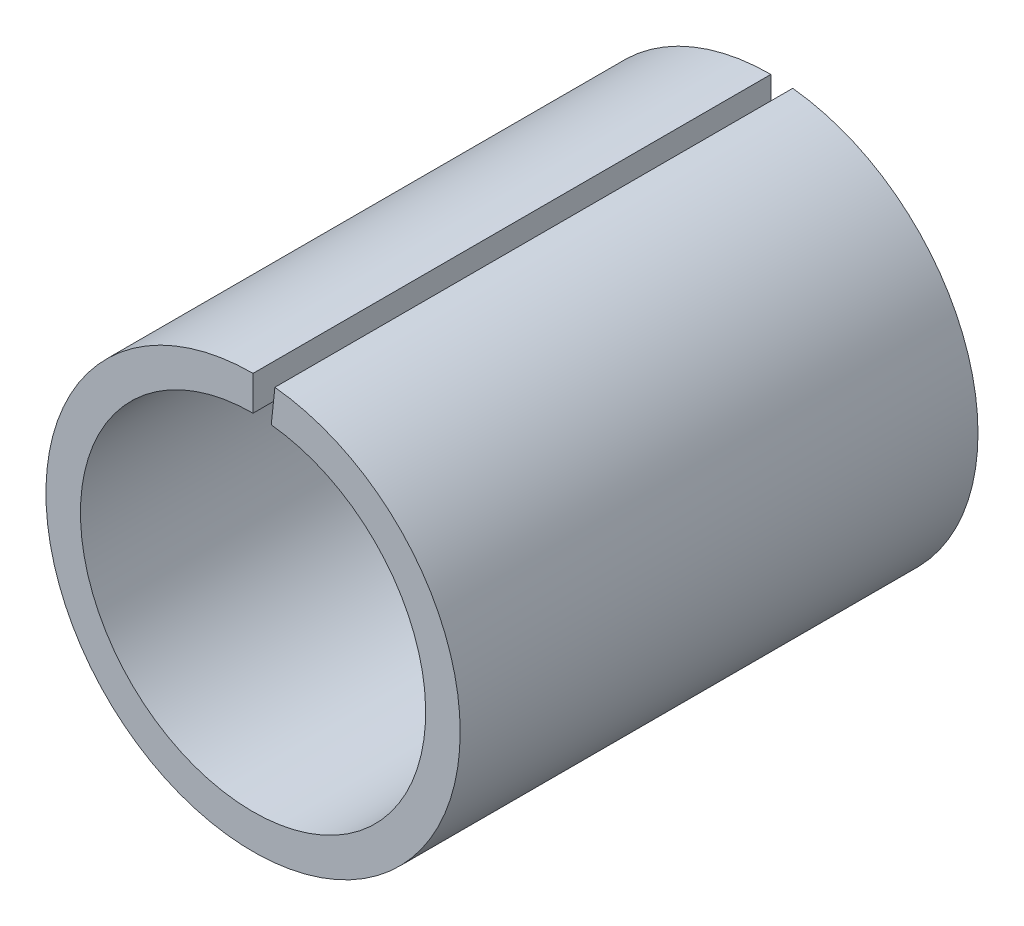
ISO-10303-21;
HEADER;
FILE_DESCRIPTION(('STEP AP214'),'2;1');
FILE_NAME('part.step','',(''),(''),'','','');
FILE_SCHEMA(('AUTOMOTIVE_DESIGN { 1 0 10303 214 1 1 1 1 }'));
ENDSEC;
DATA;
#1=APPLICATION_CONTEXT('core data for automotive mechanical design processes');
#2=APPLICATION_PROTOCOL_DEFINITION('international standard','automotive_design',2000,#1);
#3=PRODUCT_CONTEXT('',#1,'mechanical');
#4=PRODUCT('Part','Part','',(#3));
#5=PRODUCT_RELATED_PRODUCT_CATEGORY('part','',(#4));
#6=PRODUCT_DEFINITION_FORMATION('','',#4);
#7=PRODUCT_DEFINITION_CONTEXT('part definition',#1,'design');
#8=PRODUCT_DEFINITION('design','',#6,#7);
#9=PRODUCT_DEFINITION_SHAPE('','',#8);
#10=(LENGTH_UNIT() NAMED_UNIT(*) SI_UNIT(.MILLI.,.METRE.));
#11=(NAMED_UNIT(*) PLANE_ANGLE_UNIT() SI_UNIT($,.RADIAN.));
#12=(NAMED_UNIT(*) SI_UNIT($,.STERADIAN.) SOLID_ANGLE_UNIT());
#13=UNCERTAINTY_MEASURE_WITH_UNIT(LENGTH_MEASURE(1.E-05),#10,'distance_accuracy_value','');
#14=(GEOMETRIC_REPRESENTATION_CONTEXT(3) GLOBAL_UNCERTAINTY_ASSIGNED_CONTEXT((#13)) GLOBAL_UNIT_ASSIGNED_CONTEXT((#10,
#11,#12)) REPRESENTATION_CONTEXT('',''));
#15=CARTESIAN_POINT('',(0.,0.,0.));
#16=DIRECTION('',(0.,0.,1.));
#17=DIRECTION('',(1.,0.,0.));
#18=AXIS2_PLACEMENT_3D('',#15,#16,#17);
#19=CARTESIAN_POINT('',(0.,0.,15.));
#20=DIRECTION('',(0.,0.,1.));
#21=DIRECTION('',(1.,0.,0.));
#22=AXIS2_PLACEMENT_3D('',#19,#20,#21);
#23=PLANE('',#22);
#24=DIRECTION('',(0.105378003831657,0.99443223816832,0.));
#25=VECTOR('',#24,1.);
#26=CARTESIAN_POINT('',(0.817779960726739,7.71723440476091,15.));
#27=LINE('',#26,#25);
#28=CARTESIAN_POINT('',(0.526890019158286,4.9721611908416,15.));
#29=VERTEX_POINT('',#28);
#30=CARTESIAN_POINT('',(0.632268022989944,5.96659342900992,15.));
#31=VERTEX_POINT('',#30);
#32=EDGE_CURVE('E95',#29,#31,#27,.T.);
#33=ORIENTED_EDGE('',*,*,#32,.F.);
#34=CARTESIAN_POINT('',(0.,0.,15.));
#35=DIRECTION('',(0.,0.,1.));
#36=DIRECTION('',(1.,0.,0.));
#37=AXIS2_PLACEMENT_3D('',#34,#35,#36);
#38=CIRCLE('',#37,5.);
#39=CARTESIAN_POINT('',(0.,5.,15.));
#40=VERTEX_POINT('',#39);
#41=EDGE_CURVE('E93',#40,#29,#38,.T.);
#42=ORIENTED_EDGE('',*,*,#41,.F.);
#43=DIRECTION('',(0.,-1.,0.));
#44=VECTOR('',#43,1.);
#45=CARTESIAN_POINT('',(0.,0.,15.));
#46=LINE('',#45,#44);
#47=CARTESIAN_POINT('',(0.,6.,15.));
#48=VERTEX_POINT('',#47);
#49=EDGE_CURVE('E61',#48,#40,#46,.T.);
#50=ORIENTED_EDGE('',*,*,#49,.F.);
#51=CARTESIAN_POINT('',(0.,0.,15.));
#52=DIRECTION('',(0.,0.,1.));
#53=DIRECTION('',(1.,0.,0.));
#54=AXIS2_PLACEMENT_3D('',#51,#52,#53);
#55=CIRCLE('',#54,6.);
#56=EDGE_CURVE('E91',#48,#31,#55,.T.);
#57=ORIENTED_EDGE('',*,*,#56,.T.);
#58=EDGE_LOOP('',(#33,#42,#50,#57));
#59=FACE_BOUND('',#58,.T.);
#60=ADVANCED_FACE('F38',(#59),#23,.T.);
#61=CARTESIAN_POINT('',(0.,0.,0.));
#62=DIRECTION('',(0.,0.,1.));
#63=DIRECTION('',(1.,0.,0.));
#64=AXIS2_PLACEMENT_3D('',#61,#62,#63);
#65=PLANE('',#64);
#66=CARTESIAN_POINT('',(0.,0.,0.));
#67=DIRECTION('',(0.,0.,1.));
#68=DIRECTION('',(1.,0.,0.));
#69=AXIS2_PLACEMENT_3D('',#66,#67,#68);
#70=CIRCLE('',#69,5.);
#71=CARTESIAN_POINT('',(0.,5.,0.));
#72=VERTEX_POINT('',#71);
#73=CARTESIAN_POINT('',(0.526890019158286,4.9721611908416,0.));
#74=VERTEX_POINT('',#73);
#75=EDGE_CURVE('E106',#72,#74,#70,.T.);
#76=ORIENTED_EDGE('',*,*,#75,.T.);
#77=DIRECTION('',(0.105378003831657,0.994432238168321,0.));
#78=VECTOR('',#77,1.);
#79=CARTESIAN_POINT('',(0.,0.,0.));
#80=LINE('',#79,#78);
#81=CARTESIAN_POINT('',(0.632268022989944,5.96659342900992,0.));
#82=VERTEX_POINT('',#81);
#83=EDGE_CURVE('E53',#74,#82,#80,.T.);
#84=ORIENTED_EDGE('',*,*,#83,.T.);
#85=CARTESIAN_POINT('',(0.,0.,0.));
#86=DIRECTION('',(0.,0.,1.));
#87=DIRECTION('',(1.,0.,0.));
#88=AXIS2_PLACEMENT_3D('',#85,#86,#87);
#89=CIRCLE('',#88,6.);
#90=CARTESIAN_POINT('',(0.,6.,0.));
#91=VERTEX_POINT('',#90);
#92=EDGE_CURVE('E100',#91,#82,#89,.T.);
#93=ORIENTED_EDGE('',*,*,#92,.F.);
#94=DIRECTION('',(0.,-1.,0.));
#95=VECTOR('',#94,1.);
#96=CARTESIAN_POINT('',(0.,0.,0.));
#97=LINE('',#96,#95);
#98=EDGE_CURVE('E80',#91,#72,#97,.T.);
#99=ORIENTED_EDGE('',*,*,#98,.T.);
#100=EDGE_LOOP('',(#76,#84,#93,#99));
#101=FACE_BOUND('',#100,.T.);
#102=ADVANCED_FACE('F124',(#101),#65,.F.);
#103=CARTESIAN_POINT('',(0.,0.,15.));
#104=DIRECTION('',(0.,0.,-1.));
#105=DIRECTION('',(-1.,0.,0.));
#106=AXIS2_PLACEMENT_3D('',#103,#104,#105);
#107=CYLINDRICAL_SURFACE('',#106,6.);
#108=ORIENTED_EDGE('',*,*,#92,.T.);
#109=DIRECTION('',(0.,0.,-1.));
#110=VECTOR('',#109,1.);
#111=CARTESIAN_POINT('',(0.632268022989944,5.96659342900992,15.));
#112=LINE('',#111,#110);
#113=EDGE_CURVE('E98',#82,#31,#112,.F.);
#114=ORIENTED_EDGE('',*,*,#113,.T.);
#115=ORIENTED_EDGE('',*,*,#56,.F.);
#116=DIRECTION('',(0.,0.,1.));
#117=VECTOR('',#116,1.);
#118=CARTESIAN_POINT('',(0.,6.,-85.));
#119=LINE('',#118,#117);
#120=EDGE_CURVE('E77',#91,#48,#119,.T.);
#121=ORIENTED_EDGE('',*,*,#120,.F.);
#122=EDGE_LOOP('',(#108,#114,#115,#121));
#123=FACE_BOUND('',#122,.T.);
#124=ADVANCED_FACE('F40',(#123),#107,.T.);
#125=CARTESIAN_POINT('',(0.,0.,15.));
#126=DIRECTION('',(0.,0.,-1.));
#127=DIRECTION('',(-1.,0.,0.));
#128=AXIS2_PLACEMENT_3D('',#125,#126,#127);
#129=CYLINDRICAL_SURFACE('',#128,5.);
#130=DIRECTION('',(0.,0.,-1.));
#131=VECTOR('',#130,1.);
#132=CARTESIAN_POINT('',(0.526890019158286,4.9721611908416,15.));
#133=LINE('',#132,#131);
#134=EDGE_CURVE('E11',#74,#29,#133,.F.);
#135=ORIENTED_EDGE('',*,*,#134,.F.);
#136=ORIENTED_EDGE('',*,*,#75,.F.);
#137=DIRECTION('',(0.,0.,-1.));
#138=VECTOR('',#137,1.);
#139=CARTESIAN_POINT('',(0.,5.,15.));
#140=LINE('',#139,#138);
#141=EDGE_CURVE('E47',#40,#72,#140,.T.);
#142=ORIENTED_EDGE('',*,*,#141,.F.);
#143=ORIENTED_EDGE('',*,*,#41,.T.);
#144=EDGE_LOOP('',(#135,#136,#142,#143));
#145=FACE_BOUND('',#144,.T.);
#146=ADVANCED_FACE('F121',(#145),#129,.F.);
#147=CARTESIAN_POINT('',(0.,0.,-85.));
#148=DIRECTION('',(-1.,0.,0.));
#149=DIRECTION('',(0.,0.,1.));
#150=AXIS2_PLACEMENT_3D('',#147,#148,#149);
#151=PLANE('',#150);
#152=ORIENTED_EDGE('',*,*,#120,.T.);
#153=ORIENTED_EDGE('',*,*,#49,.T.);
#154=ORIENTED_EDGE('',*,*,#141,.T.);
#155=ORIENTED_EDGE('',*,*,#98,.F.);
#156=EDGE_LOOP('',(#152,#153,#154,#155));
#157=FACE_BOUND('',#156,.T.);
#158=ADVANCED_FACE('F78',(#157),#151,.F.);
#159=CARTESIAN_POINT('',(0.817779960726739,7.71723440476091,-85.));
#160=DIRECTION('',(0.994432238168321,-0.105378003831657,0.));
#161=DIRECTION('',(0.105378003831657,0.994432238168321,0.));
#162=AXIS2_PLACEMENT_3D('',#159,#160,#161);
#163=PLANE('',#162);
#164=ORIENTED_EDGE('',*,*,#83,.F.);
#165=ORIENTED_EDGE('',*,*,#134,.T.);
#166=ORIENTED_EDGE('',*,*,#32,.T.);
#167=ORIENTED_EDGE('',*,*,#113,.F.);
#168=EDGE_LOOP('',(#164,#165,#166,#167));
#169=FACE_BOUND('',#168,.T.);
#170=ADVANCED_FACE('F119',(#169),#163,.F.);
#171=CLOSED_SHELL('',(#60,#102,#124,#146,#158,#170));
#172=MANIFOLD_SOLID_BREP('B2',#171);
#173=ADVANCED_BREP_SHAPE_REPRESENTATION('',(#18,#172),#14);
#174=SHAPE_DEFINITION_REPRESENTATION(#9,#173);
ENDSEC;
END-ISO-10303-21;
